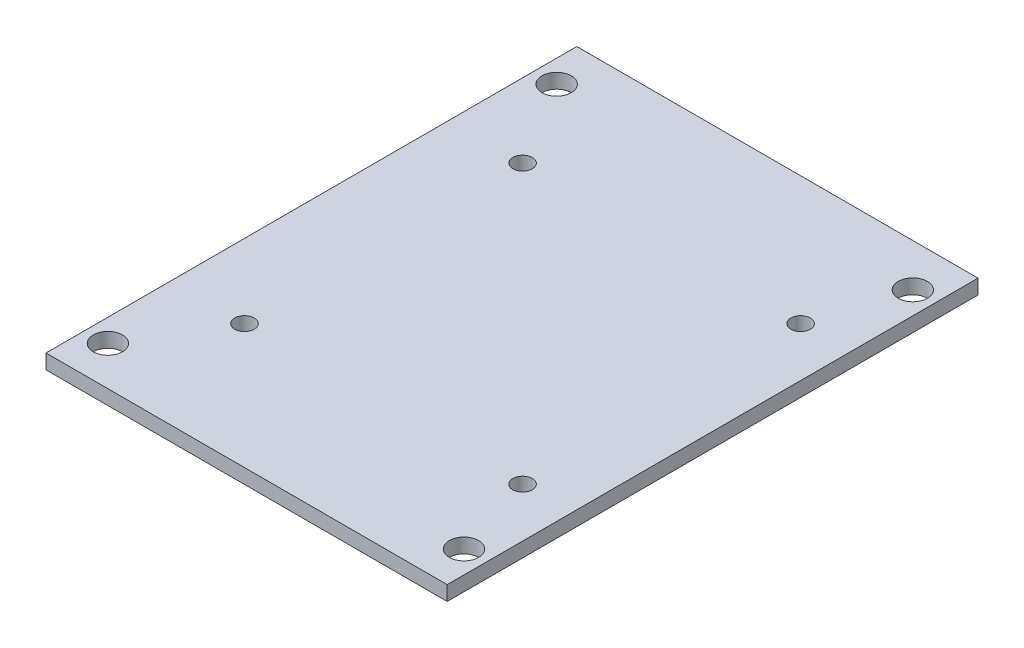
ISO-10303-21;
HEADER;
FILE_DESCRIPTION(('STEP AP214'),'2;1');
FILE_NAME('part.step','',(''),(''),'','','');
FILE_SCHEMA(('AUTOMOTIVE_DESIGN { 1 0 10303 214 1 1 1 1 }'));
ENDSEC;
DATA;
#1=APPLICATION_CONTEXT('core data for automotive mechanical design processes');
#2=APPLICATION_PROTOCOL_DEFINITION('international standard','automotive_design',2000,#1);
#3=PRODUCT_CONTEXT('',#1,'mechanical');
#4=PRODUCT('Part','Part','',(#3));
#5=PRODUCT_RELATED_PRODUCT_CATEGORY('part','',(#4));
#6=PRODUCT_DEFINITION_FORMATION('','',#4);
#7=PRODUCT_DEFINITION_CONTEXT('part definition',#1,'design');
#8=PRODUCT_DEFINITION('design','',#6,#7);
#9=PRODUCT_DEFINITION_SHAPE('','',#8);
#10=(LENGTH_UNIT() NAMED_UNIT(*) SI_UNIT(.MILLI.,.METRE.));
#11=(NAMED_UNIT(*) PLANE_ANGLE_UNIT() SI_UNIT($,.RADIAN.));
#12=(NAMED_UNIT(*) SI_UNIT($,.STERADIAN.) SOLID_ANGLE_UNIT());
#13=UNCERTAINTY_MEASURE_WITH_UNIT(LENGTH_MEASURE(1.E-05),#10,'distance_accuracy_value','');
#14=(GEOMETRIC_REPRESENTATION_CONTEXT(3) GLOBAL_UNCERTAINTY_ASSIGNED_CONTEXT((#13)) GLOBAL_UNIT_ASSIGNED_CONTEXT((#10,
#11,#12)) REPRESENTATION_CONTEXT('',''));
#15=CARTESIAN_POINT('',(0.,0.,0.));
#16=DIRECTION('',(0.,0.,1.));
#17=DIRECTION('',(1.,0.,0.));
#18=AXIS2_PLACEMENT_3D('',#15,#16,#17);
#19=CARTESIAN_POINT('',(0.,1.5,0.));
#20=DIRECTION('',(0.,1.,0.));
#21=DIRECTION('',(0.,0.,1.));
#22=AXIS2_PLACEMENT_3D('',#19,#20,#21);
#23=PLANE('',#22);
#24=CARTESIAN_POINT('',(17.,1.5,23.));
#25=DIRECTION('',(0.,1.,0.));
#26=DIRECTION('',(0.,0.,1.));
#27=AXIS2_PLACEMENT_3D('',#24,#25,#26);
#28=CIRCLE('',#27,1.5);
#29=CARTESIAN_POINT('',(17.,1.5,24.5));
#30=VERTEX_POINT('',#29);
#31=EDGE_CURVE('E174',#30,#30,#28,.T.);
#32=ORIENTED_EDGE('',*,*,#31,.F.);
#33=EDGE_LOOP('',(#32));
#34=FACE_BOUND('',#33,.T.);
#35=CARTESIAN_POINT('',(-14.2499999999992,1.5,14.25));
#36=DIRECTION('',(0.,1.,0.));
#37=DIRECTION('',(0.,0.,1.));
#38=AXIS2_PLACEMENT_3D('',#35,#36,#37);
#39=CIRCLE('',#38,1.00000000000043);
#40=CARTESIAN_POINT('',(-14.2499999999992,1.5,15.2500000000004));
#41=VERTEX_POINT('',#40);
#42=EDGE_CURVE('E158',#41,#41,#39,.T.);
#43=ORIENTED_EDGE('',*,*,#42,.F.);
#44=EDGE_LOOP('',(#43));
#45=FACE_BOUND('',#44,.T.);
#46=CARTESIAN_POINT('',(14.25,1.5,-14.2500000000008));
#47=DIRECTION('',(0.,1.,0.));
#48=DIRECTION('',(0.,0.,1.));
#49=AXIS2_PLACEMENT_3D('',#46,#47,#48);
#50=CIRCLE('',#49,1.00000000000084);
#51=CARTESIAN_POINT('',(14.25,1.5,-13.25));
#52=VERTEX_POINT('',#51);
#53=EDGE_CURVE('E142',#52,#52,#50,.T.);
#54=ORIENTED_EDGE('',*,*,#53,.F.);
#55=EDGE_LOOP('',(#54));
#56=FACE_BOUND('',#55,.T.);
#57=CARTESIAN_POINT('',(-14.25,1.5,-14.25));
#58=DIRECTION('',(0.,1.,0.));
#59=DIRECTION('',(0.,0.,1.));
#60=AXIS2_PLACEMENT_3D('',#57,#58,#59);
#61=CIRCLE('',#60,1.);
#62=CARTESIAN_POINT('',(-14.25,1.5,-13.25));
#63=VERTEX_POINT('',#62);
#64=EDGE_CURVE('E112',#63,#63,#61,.T.);
#65=ORIENTED_EDGE('',*,*,#64,.F.);
#66=EDGE_LOOP('',(#65));
#67=FACE_BOUND('',#66,.T.);
#68=DIRECTION('',(0.,0.,1.));
#69=VECTOR('',#68,1.);
#70=CARTESIAN_POINT('',(-21.819,1.5,-27.381));
#71=LINE('',#70,#69);
#72=CARTESIAN_POINT('',(-21.819,1.5,-27.381));
#73=VERTEX_POINT('',#72);
#74=CARTESIAN_POINT('',(-21.819,1.5,27.026));
#75=VERTEX_POINT('',#74);
#76=EDGE_CURVE('E92',#73,#75,#71,.T.);
#77=ORIENTED_EDGE('',*,*,#76,.T.);
#78=DIRECTION('',(1.,0.,0.));
#79=VECTOR('',#78,1.);
#80=CARTESIAN_POINT('',(-21.819,1.5,27.026));
#81=LINE('',#80,#79);
#82=CARTESIAN_POINT('',(19.304,1.5,27.026));
#83=VERTEX_POINT('',#82);
#84=EDGE_CURVE('E87',#75,#83,#81,.T.);
#85=ORIENTED_EDGE('',*,*,#84,.T.);
#86=DIRECTION('',(0.,0.,-1.));
#87=VECTOR('',#86,1.);
#88=CARTESIAN_POINT('',(19.304,1.5,-27.381));
#89=LINE('',#88,#87);
#90=CARTESIAN_POINT('',(19.304,1.5,-27.381));
#91=VERTEX_POINT('',#90);
#92=EDGE_CURVE('E90',#83,#91,#89,.T.);
#93=ORIENTED_EDGE('',*,*,#92,.T.);
#94=DIRECTION('',(-1.,0.,0.));
#95=VECTOR('',#94,1.);
#96=CARTESIAN_POINT('',(-21.819,1.5,-27.381));
#97=LINE('',#96,#95);
#98=EDGE_CURVE('E57',#91,#73,#97,.T.);
#99=ORIENTED_EDGE('',*,*,#98,.T.);
#100=EDGE_LOOP('',(#77,#85,#93,#99));
#101=FACE_BOUND('',#100,.T.);
#102=CARTESIAN_POINT('',(-19.5,1.5,-23.));
#103=DIRECTION('',(0.,1.,0.));
#104=DIRECTION('',(0.,0.,1.));
#105=AXIS2_PLACEMENT_3D('',#102,#103,#104);
#106=CIRCLE('',#105,1.5);
#107=CARTESIAN_POINT('',(-19.5,1.5,-21.5));
#108=VERTEX_POINT('',#107);
#109=EDGE_CURVE('E134',#108,#108,#106,.T.);
#110=ORIENTED_EDGE('',*,*,#109,.F.);
#111=EDGE_LOOP('',(#110));
#112=FACE_BOUND('',#111,.T.);
#113=CARTESIAN_POINT('',(14.2500000000008,1.5,14.2499999999992));
#114=DIRECTION('',(0.,1.,0.));
#115=DIRECTION('',(0.,0.,1.));
#116=AXIS2_PLACEMENT_3D('',#113,#114,#115);
#117=CIRCLE('',#116,1.00000000000114);
#118=CARTESIAN_POINT('',(14.2500000000008,1.5,15.2500000000003));
#119=VERTEX_POINT('',#118);
#120=EDGE_CURVE('E150',#119,#119,#117,.T.);
#121=ORIENTED_EDGE('',*,*,#120,.F.);
#122=EDGE_LOOP('',(#121));
#123=FACE_BOUND('',#122,.T.);
#124=CARTESIAN_POINT('',(17.,1.5,-23.));
#125=DIRECTION('',(0.,1.,0.));
#126=DIRECTION('',(0.,0.,1.));
#127=AXIS2_PLACEMENT_3D('',#124,#125,#126);
#128=CIRCLE('',#127,1.5);
#129=CARTESIAN_POINT('',(17.,1.5,-21.5));
#130=VERTEX_POINT('',#129);
#131=EDGE_CURVE('E166',#130,#130,#128,.T.);
#132=ORIENTED_EDGE('',*,*,#131,.F.);
#133=EDGE_LOOP('',(#132));
#134=FACE_BOUND('',#133,.T.);
#135=CARTESIAN_POINT('',(-19.5,1.5,23.));
#136=DIRECTION('',(0.,1.,0.));
#137=DIRECTION('',(0.,0.,1.));
#138=AXIS2_PLACEMENT_3D('',#135,#136,#137);
#139=CIRCLE('',#138,1.5);
#140=CARTESIAN_POINT('',(-19.5,1.5,24.5));
#141=VERTEX_POINT('',#140);
#142=EDGE_CURVE('E182',#141,#141,#139,.T.);
#143=ORIENTED_EDGE('',*,*,#142,.F.);
#144=EDGE_LOOP('',(#143));
#145=FACE_BOUND('',#144,.T.);
#146=ADVANCED_FACE('F39',(#34,#45,#56,#67,#101,#112,#123,#134,#145),#23,.T.);
#147=CARTESIAN_POINT('',(0.,0.,0.));
#148=DIRECTION('',(0.,1.,0.));
#149=DIRECTION('',(0.,0.,1.));
#150=AXIS2_PLACEMENT_3D('',#147,#148,#149);
#151=PLANE('',#150);
#152=DIRECTION('',(0.,0.,1.));
#153=VECTOR('',#152,1.);
#154=CARTESIAN_POINT('',(-21.819,0.,-27.381));
#155=LINE('',#154,#153);
#156=CARTESIAN_POINT('',(-21.819,0.,-27.381));
#157=VERTEX_POINT('',#156);
#158=CARTESIAN_POINT('',(-21.819,0.,27.026));
#159=VERTEX_POINT('',#158);
#160=EDGE_CURVE('E108',#157,#159,#155,.T.);
#161=ORIENTED_EDGE('',*,*,#160,.F.);
#162=DIRECTION('',(-1.,0.,0.));
#163=VECTOR('',#162,1.);
#164=CARTESIAN_POINT('',(-21.819,0.,-27.381));
#165=LINE('',#164,#163);
#166=CARTESIAN_POINT('',(19.304,0.,-27.381));
#167=VERTEX_POINT('',#166);
#168=EDGE_CURVE('E80',#167,#157,#165,.T.);
#169=ORIENTED_EDGE('',*,*,#168,.F.);
#170=DIRECTION('',(0.,0.,-1.));
#171=VECTOR('',#170,1.);
#172=CARTESIAN_POINT('',(19.304,0.,-27.381));
#173=LINE('',#172,#171);
#174=CARTESIAN_POINT('',(19.304,0.,27.026));
#175=VERTEX_POINT('',#174);
#176=EDGE_CURVE('E74',#175,#167,#173,.T.);
#177=ORIENTED_EDGE('',*,*,#176,.F.);
#178=DIRECTION('',(1.,0.,0.));
#179=VECTOR('',#178,1.);
#180=CARTESIAN_POINT('',(-21.819,0.,27.026));
#181=LINE('',#180,#179);
#182=EDGE_CURVE('E97',#159,#175,#181,.T.);
#183=ORIENTED_EDGE('',*,*,#182,.F.);
#184=EDGE_LOOP('',(#161,#169,#177,#183));
#185=FACE_BOUND('',#184,.T.);
#186=CARTESIAN_POINT('',(-14.25,0.,-14.25));
#187=DIRECTION('',(0.,1.,0.));
#188=DIRECTION('',(0.,0.,1.));
#189=AXIS2_PLACEMENT_3D('',#186,#187,#188);
#190=CIRCLE('',#189,1.);
#191=CARTESIAN_POINT('',(-14.25,0.,-13.25));
#192=VERTEX_POINT('',#191);
#193=EDGE_CURVE('E130',#192,#192,#190,.T.);
#194=ORIENTED_EDGE('',*,*,#193,.T.);
#195=EDGE_LOOP('',(#194));
#196=FACE_BOUND('',#195,.T.);
#197=CARTESIAN_POINT('',(-19.5,0.,-23.));
#198=DIRECTION('',(0.,1.,0.));
#199=DIRECTION('',(0.,0.,1.));
#200=AXIS2_PLACEMENT_3D('',#197,#198,#199);
#201=CIRCLE('',#200,1.5);
#202=CARTESIAN_POINT('',(-19.5,0.,-21.5));
#203=VERTEX_POINT('',#202);
#204=EDGE_CURVE('E138',#203,#203,#201,.T.);
#205=ORIENTED_EDGE('',*,*,#204,.T.);
#206=EDGE_LOOP('',(#205));
#207=FACE_BOUND('',#206,.T.);
#208=CARTESIAN_POINT('',(14.25,0.,-14.2500000000008));
#209=DIRECTION('',(0.,1.,0.));
#210=DIRECTION('',(0.,0.,1.));
#211=AXIS2_PLACEMENT_3D('',#208,#209,#210);
#212=CIRCLE('',#211,1.00000000000084);
#213=CARTESIAN_POINT('',(14.25,0.,-13.25));
#214=VERTEX_POINT('',#213);
#215=EDGE_CURVE('E146',#214,#214,#212,.T.);
#216=ORIENTED_EDGE('',*,*,#215,.T.);
#217=EDGE_LOOP('',(#216));
#218=FACE_BOUND('',#217,.T.);
#219=CARTESIAN_POINT('',(14.2500000000008,0.,14.2499999999992));
#220=DIRECTION('',(0.,1.,0.));
#221=DIRECTION('',(0.,0.,1.));
#222=AXIS2_PLACEMENT_3D('',#219,#220,#221);
#223=CIRCLE('',#222,1.00000000000114);
#224=CARTESIAN_POINT('',(14.2500000000008,0.,15.2500000000003));
#225=VERTEX_POINT('',#224);
#226=EDGE_CURVE('E154',#225,#225,#223,.T.);
#227=ORIENTED_EDGE('',*,*,#226,.T.);
#228=EDGE_LOOP('',(#227));
#229=FACE_BOUND('',#228,.T.);
#230=CARTESIAN_POINT('',(-14.2499999999992,0.,14.25));
#231=DIRECTION('',(0.,1.,0.));
#232=DIRECTION('',(0.,0.,1.));
#233=AXIS2_PLACEMENT_3D('',#230,#231,#232);
#234=CIRCLE('',#233,1.00000000000043);
#235=CARTESIAN_POINT('',(-14.2499999999992,0.,15.2500000000004));
#236=VERTEX_POINT('',#235);
#237=EDGE_CURVE('E162',#236,#236,#234,.T.);
#238=ORIENTED_EDGE('',*,*,#237,.T.);
#239=EDGE_LOOP('',(#238));
#240=FACE_BOUND('',#239,.T.);
#241=CARTESIAN_POINT('',(17.,0.,-23.));
#242=DIRECTION('',(0.,1.,0.));
#243=DIRECTION('',(0.,0.,1.));
#244=AXIS2_PLACEMENT_3D('',#241,#242,#243);
#245=CIRCLE('',#244,1.5);
#246=CARTESIAN_POINT('',(17.,0.,-21.5));
#247=VERTEX_POINT('',#246);
#248=EDGE_CURVE('E170',#247,#247,#245,.T.);
#249=ORIENTED_EDGE('',*,*,#248,.T.);
#250=EDGE_LOOP('',(#249));
#251=FACE_BOUND('',#250,.T.);
#252=CARTESIAN_POINT('',(17.,0.,23.));
#253=DIRECTION('',(0.,1.,0.));
#254=DIRECTION('',(0.,0.,1.));
#255=AXIS2_PLACEMENT_3D('',#252,#253,#254);
#256=CIRCLE('',#255,1.5);
#257=CARTESIAN_POINT('',(17.,0.,24.5));
#258=VERTEX_POINT('',#257);
#259=EDGE_CURVE('E178',#258,#258,#256,.T.);
#260=ORIENTED_EDGE('',*,*,#259,.T.);
#261=EDGE_LOOP('',(#260));
#262=FACE_BOUND('',#261,.T.);
#263=CARTESIAN_POINT('',(-19.5,0.,23.));
#264=DIRECTION('',(0.,1.,0.));
#265=DIRECTION('',(0.,0.,1.));
#266=AXIS2_PLACEMENT_3D('',#263,#264,#265);
#267=CIRCLE('',#266,1.5);
#268=CARTESIAN_POINT('',(-19.5,0.,24.5));
#269=VERTEX_POINT('',#268);
#270=EDGE_CURVE('E186',#269,#269,#267,.T.);
#271=ORIENTED_EDGE('',*,*,#270,.T.);
#272=EDGE_LOOP('',(#271));
#273=FACE_BOUND('',#272,.T.);
#274=ADVANCED_FACE('F125',(#185,#196,#207,#218,#229,#240,#251,#262,#273),#151,.F.);
#275=CARTESIAN_POINT('',(-21.819,1.5,-27.381));
#276=DIRECTION('',(1.,0.,0.));
#277=DIRECTION('',(0.,0.,-1.));
#278=AXIS2_PLACEMENT_3D('',#275,#276,#277);
#279=PLANE('',#278);
#280=ORIENTED_EDGE('',*,*,#160,.T.);
#281=DIRECTION('',(0.,-1.,0.));
#282=VECTOR('',#281,1.);
#283=CARTESIAN_POINT('',(-21.819,1.5,27.026));
#284=LINE('',#283,#282);
#285=EDGE_CURVE('E11',#75,#159,#284,.T.);
#286=ORIENTED_EDGE('',*,*,#285,.F.);
#287=ORIENTED_EDGE('',*,*,#76,.F.);
#288=DIRECTION('',(0.,-1.,0.));
#289=VECTOR('',#288,1.);
#290=CARTESIAN_POINT('',(-21.819,1.5,-27.381));
#291=LINE('',#290,#289);
#292=EDGE_CURVE('E104',#73,#157,#291,.T.);
#293=ORIENTED_EDGE('',*,*,#292,.T.);
#294=EDGE_LOOP('',(#280,#286,#287,#293));
#295=FACE_BOUND('',#294,.T.);
#296=ADVANCED_FACE('F41',(#295),#279,.F.);
#297=CARTESIAN_POINT('',(-21.819,1.5,27.026));
#298=DIRECTION('',(0.,0.,-1.));
#299=DIRECTION('',(-1.,0.,0.));
#300=AXIS2_PLACEMENT_3D('',#297,#298,#299);
#301=PLANE('',#300);
#302=ORIENTED_EDGE('',*,*,#182,.T.);
#303=DIRECTION('',(0.,-1.,0.));
#304=VECTOR('',#303,1.);
#305=CARTESIAN_POINT('',(19.304,1.5,27.026));
#306=LINE('',#305,#304);
#307=EDGE_CURVE('E49',#83,#175,#306,.T.);
#308=ORIENTED_EDGE('',*,*,#307,.F.);
#309=ORIENTED_EDGE('',*,*,#84,.F.);
#310=ORIENTED_EDGE('',*,*,#285,.T.);
#311=EDGE_LOOP('',(#302,#308,#309,#310));
#312=FACE_BOUND('',#311,.T.);
#313=ADVANCED_FACE('F96',(#312),#301,.F.);
#314=CARTESIAN_POINT('',(19.304,1.5,-27.381));
#315=DIRECTION('',(-1.,0.,0.));
#316=DIRECTION('',(0.,0.,1.));
#317=AXIS2_PLACEMENT_3D('',#314,#315,#316);
#318=PLANE('',#317);
#319=ORIENTED_EDGE('',*,*,#176,.T.);
#320=DIRECTION('',(0.,-1.,0.));
#321=VECTOR('',#320,1.);
#322=CARTESIAN_POINT('',(19.304,1.5,-27.381));
#323=LINE('',#322,#321);
#324=EDGE_CURVE('E99',#91,#167,#323,.T.);
#325=ORIENTED_EDGE('',*,*,#324,.F.);
#326=ORIENTED_EDGE('',*,*,#92,.F.);
#327=ORIENTED_EDGE('',*,*,#307,.T.);
#328=EDGE_LOOP('',(#319,#325,#326,#327));
#329=FACE_BOUND('',#328,.T.);
#330=ADVANCED_FACE('F100',(#329),#318,.F.);
#331=CARTESIAN_POINT('',(-21.819,1.5,-27.381));
#332=DIRECTION('',(0.,0.,1.));
#333=DIRECTION('',(1.,0.,0.));
#334=AXIS2_PLACEMENT_3D('',#331,#332,#333);
#335=PLANE('',#334);
#336=ORIENTED_EDGE('',*,*,#168,.T.);
#337=ORIENTED_EDGE('',*,*,#292,.F.);
#338=ORIENTED_EDGE('',*,*,#98,.F.);
#339=ORIENTED_EDGE('',*,*,#324,.T.);
#340=EDGE_LOOP('',(#336,#337,#338,#339));
#341=FACE_BOUND('',#340,.T.);
#342=ADVANCED_FACE('F122',(#341),#335,.F.);
#343=CARTESIAN_POINT('',(-14.25,1.5,-14.25));
#344=DIRECTION('',(0.,-1.,0.));
#345=DIRECTION('',(0.,0.,-1.));
#346=AXIS2_PLACEMENT_3D('',#343,#344,#345);
#347=CYLINDRICAL_SURFACE('',#346,1.);
#348=ORIENTED_EDGE('',*,*,#64,.T.);
#349=EDGE_LOOP('',(#348));
#350=FACE_BOUND('',#349,.T.);
#351=ORIENTED_EDGE('',*,*,#193,.F.);
#352=EDGE_LOOP('',(#351));
#353=FACE_BOUND('',#352,.T.);
#354=ADVANCED_FACE('F207',(#350,#353),#347,.F.);
#355=CARTESIAN_POINT('',(-19.5,1.5,-23.));
#356=DIRECTION('',(0.,-1.,0.));
#357=DIRECTION('',(0.,0.,-1.));
#358=AXIS2_PLACEMENT_3D('',#355,#356,#357);
#359=CYLINDRICAL_SURFACE('',#358,1.5);
#360=ORIENTED_EDGE('',*,*,#109,.T.);
#361=EDGE_LOOP('',(#360));
#362=FACE_BOUND('',#361,.T.);
#363=ORIENTED_EDGE('',*,*,#204,.F.);
#364=EDGE_LOOP('',(#363));
#365=FACE_BOUND('',#364,.T.);
#366=ADVANCED_FACE('F253',(#362,#365),#359,.F.);
#367=CARTESIAN_POINT('',(14.25,1.5,-14.2500000000008));
#368=DIRECTION('',(0.,-1.,0.));
#369=DIRECTION('',(0.,0.,-1.));
#370=AXIS2_PLACEMENT_3D('',#367,#368,#369);
#371=CYLINDRICAL_SURFACE('',#370,1.00000000000084);
#372=ORIENTED_EDGE('',*,*,#53,.T.);
#373=EDGE_LOOP('',(#372));
#374=FACE_BOUND('',#373,.T.);
#375=ORIENTED_EDGE('',*,*,#215,.F.);
#376=EDGE_LOOP('',(#375));
#377=FACE_BOUND('',#376,.T.);
#378=ADVANCED_FACE('F261',(#374,#377),#371,.F.);
#379=CARTESIAN_POINT('',(14.2500000000008,1.5,14.2499999999992));
#380=DIRECTION('',(0.,-1.,0.));
#381=DIRECTION('',(0.,0.,-1.));
#382=AXIS2_PLACEMENT_3D('',#379,#380,#381);
#383=CYLINDRICAL_SURFACE('',#382,1.00000000000114);
#384=ORIENTED_EDGE('',*,*,#120,.T.);
#385=EDGE_LOOP('',(#384));
#386=FACE_BOUND('',#385,.T.);
#387=ORIENTED_EDGE('',*,*,#226,.F.);
#388=EDGE_LOOP('',(#387));
#389=FACE_BOUND('',#388,.T.);
#390=ADVANCED_FACE('F269',(#386,#389),#383,.F.);
#391=CARTESIAN_POINT('',(-14.2499999999992,1.5,14.25));
#392=DIRECTION('',(0.,-1.,0.));
#393=DIRECTION('',(0.,0.,-1.));
#394=AXIS2_PLACEMENT_3D('',#391,#392,#393);
#395=CYLINDRICAL_SURFACE('',#394,1.00000000000043);
#396=ORIENTED_EDGE('',*,*,#42,.T.);
#397=EDGE_LOOP('',(#396));
#398=FACE_BOUND('',#397,.T.);
#399=ORIENTED_EDGE('',*,*,#237,.F.);
#400=EDGE_LOOP('',(#399));
#401=FACE_BOUND('',#400,.T.);
#402=ADVANCED_FACE('F278',(#398,#401),#395,.F.);
#403=CARTESIAN_POINT('',(17.,1.5,-23.));
#404=DIRECTION('',(0.,-1.,0.));
#405=DIRECTION('',(0.,0.,-1.));
#406=AXIS2_PLACEMENT_3D('',#403,#404,#405);
#407=CYLINDRICAL_SURFACE('',#406,1.5);
#408=ORIENTED_EDGE('',*,*,#131,.T.);
#409=EDGE_LOOP('',(#408));
#410=FACE_BOUND('',#409,.T.);
#411=ORIENTED_EDGE('',*,*,#248,.F.);
#412=EDGE_LOOP('',(#411));
#413=FACE_BOUND('',#412,.T.);
#414=ADVANCED_FACE('F287',(#410,#413),#407,.F.);
#415=CARTESIAN_POINT('',(17.,1.5,23.));
#416=DIRECTION('',(0.,-1.,0.));
#417=DIRECTION('',(0.,0.,-1.));
#418=AXIS2_PLACEMENT_3D('',#415,#416,#417);
#419=CYLINDRICAL_SURFACE('',#418,1.5);
#420=ORIENTED_EDGE('',*,*,#31,.T.);
#421=EDGE_LOOP('',(#420));
#422=FACE_BOUND('',#421,.T.);
#423=ORIENTED_EDGE('',*,*,#259,.F.);
#424=EDGE_LOOP('',(#423));
#425=FACE_BOUND('',#424,.T.);
#426=ADVANCED_FACE('F296',(#422,#425),#419,.F.);
#427=CARTESIAN_POINT('',(-19.5,1.5,23.));
#428=DIRECTION('',(0.,-1.,0.));
#429=DIRECTION('',(0.,0.,-1.));
#430=AXIS2_PLACEMENT_3D('',#427,#428,#429);
#431=CYLINDRICAL_SURFACE('',#430,1.5);
#432=ORIENTED_EDGE('',*,*,#142,.T.);
#433=EDGE_LOOP('',(#432));
#434=FACE_BOUND('',#433,.T.);
#435=ORIENTED_EDGE('',*,*,#270,.F.);
#436=EDGE_LOOP('',(#435));
#437=FACE_BOUND('',#436,.T.);
#438=ADVANCED_FACE('F194',(#434,#437),#431,.F.);
#439=CLOSED_SHELL('',(#146,#274,#296,#313,#330,#342,#354,#366,#378,#390,#402,#414,#426,#438));
#440=MANIFOLD_SOLID_BREP('B2',#439);
#441=ADVANCED_BREP_SHAPE_REPRESENTATION('',(#18,#440),#14);
#442=SHAPE_DEFINITION_REPRESENTATION(#9,#441);
ENDSEC;
END-ISO-10303-21;
